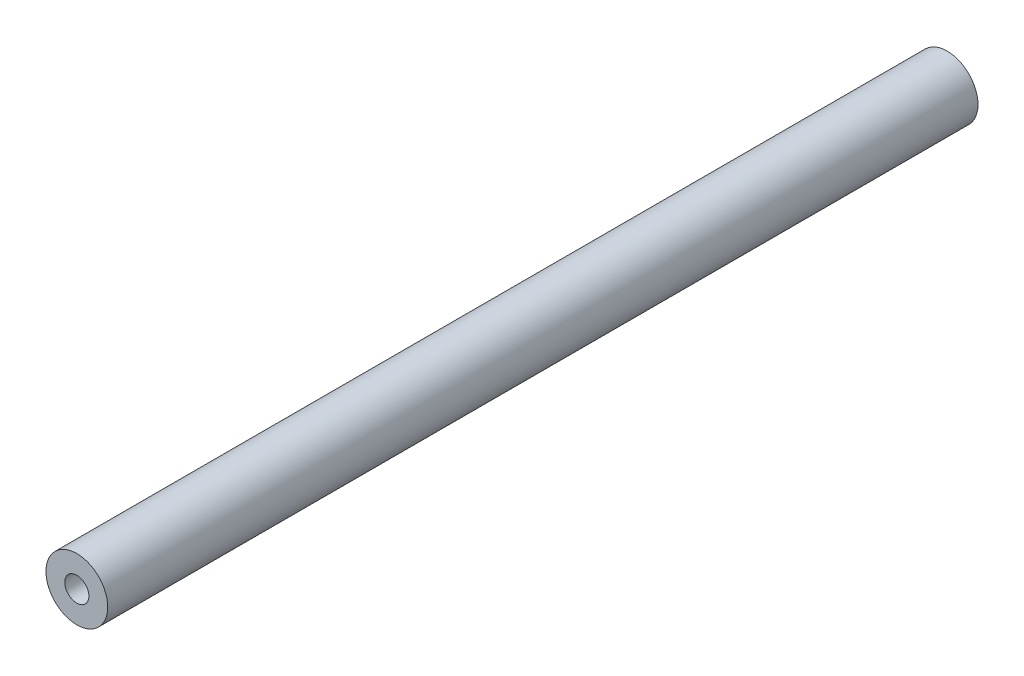
ISO-10303-21;
HEADER;
FILE_DESCRIPTION(('STEP AP214'),'2;1');
FILE_NAME('part.step','',(''),(''),'','','');
FILE_SCHEMA(('AUTOMOTIVE_DESIGN { 1 0 10303 214 1 1 1 1 }'));
ENDSEC;
DATA;
#1=APPLICATION_CONTEXT('core data for automotive mechanical design processes');
#2=APPLICATION_PROTOCOL_DEFINITION('international standard','automotive_design',2000,#1);
#3=PRODUCT_CONTEXT('',#1,'mechanical');
#4=PRODUCT('Part','Part','',(#3));
#5=PRODUCT_RELATED_PRODUCT_CATEGORY('part','',(#4));
#6=PRODUCT_DEFINITION_FORMATION('','',#4);
#7=PRODUCT_DEFINITION_CONTEXT('part definition',#1,'design');
#8=PRODUCT_DEFINITION('design','',#6,#7);
#9=PRODUCT_DEFINITION_SHAPE('','',#8);
#10=(LENGTH_UNIT() NAMED_UNIT(*) SI_UNIT(.MILLI.,.METRE.));
#11=(NAMED_UNIT(*) PLANE_ANGLE_UNIT() SI_UNIT($,.RADIAN.));
#12=(NAMED_UNIT(*) SI_UNIT($,.STERADIAN.) SOLID_ANGLE_UNIT());
#13=UNCERTAINTY_MEASURE_WITH_UNIT(LENGTH_MEASURE(1.E-05),#10,'distance_accuracy_value','');
#14=(GEOMETRIC_REPRESENTATION_CONTEXT(3) GLOBAL_UNCERTAINTY_ASSIGNED_CONTEXT((#13)) GLOBAL_UNIT_ASSIGNED_CONTEXT((#10,
#11,#12)) REPRESENTATION_CONTEXT('',''));
#15=CARTESIAN_POINT('',(0.,0.,0.));
#16=DIRECTION('',(0.,0.,1.));
#17=DIRECTION('',(1.,0.,0.));
#18=AXIS2_PLACEMENT_3D('',#15,#16,#17);
#19=CARTESIAN_POINT('',(0.,0.,155.));
#20=DIRECTION('',(0.,0.,-1.));
#21=DIRECTION('',(-1.,0.,0.));
#22=AXIS2_PLACEMENT_3D('',#19,#20,#21);
#23=CYLINDRICAL_SURFACE('',#22,5.5);
#24=CARTESIAN_POINT('',(0.,0.,155.));
#25=DIRECTION('',(0.,0.,1.));
#26=DIRECTION('',(1.,0.,0.));
#27=AXIS2_PLACEMENT_3D('',#24,#25,#26);
#28=CIRCLE('',#27,5.5);
#29=CARTESIAN_POINT('',(5.5,0.,155.));
#30=VERTEX_POINT('',#29);
#31=EDGE_CURVE('E10',#30,#30,#28,.T.);
#32=ORIENTED_EDGE('',*,*,#31,.F.);
#33=EDGE_LOOP('',(#32));
#34=FACE_BOUND('',#33,.T.);
#35=CARTESIAN_POINT('',(0.,0.,0.));
#36=DIRECTION('',(0.,0.,1.));
#37=DIRECTION('',(1.,0.,0.));
#38=AXIS2_PLACEMENT_3D('',#35,#36,#37);
#39=CIRCLE('',#38,5.5);
#40=CARTESIAN_POINT('',(5.5,0.,0.));
#41=VERTEX_POINT('',#40);
#42=EDGE_CURVE('E34',#41,#41,#39,.T.);
#43=ORIENTED_EDGE('',*,*,#42,.T.);
#44=EDGE_LOOP('',(#43));
#45=FACE_BOUND('',#44,.T.);
#46=ADVANCED_FACE('F31',(#34,#45),#23,.T.);
#47=CARTESIAN_POINT('',(0.,0.,155.));
#48=DIRECTION('',(0.,0.,1.));
#49=DIRECTION('',(1.,0.,0.));
#50=AXIS2_PLACEMENT_3D('',#47,#48,#49);
#51=PLANE('',#50);
#52=CARTESIAN_POINT('',(0.,0.,155.));
#53=DIRECTION('',(0.,0.,1.));
#54=DIRECTION('',(1.,0.,0.));
#55=AXIS2_PLACEMENT_3D('',#52,#53,#54);
#56=CIRCLE('',#55,2.15);
#57=CARTESIAN_POINT('',(2.15,0.,155.));
#58=VERTEX_POINT('',#57);
#59=EDGE_CURVE('E43',#58,#58,#56,.T.);
#60=ORIENTED_EDGE('',*,*,#59,.F.);
#61=EDGE_LOOP('',(#60));
#62=FACE_BOUND('',#61,.T.);
#63=ORIENTED_EDGE('',*,*,#31,.T.);
#64=EDGE_LOOP('',(#63));
#65=FACE_BOUND('',#64,.T.);
#66=ADVANCED_FACE('F58',(#62,#65),#51,.T.);
#67=CARTESIAN_POINT('',(0.,0.,0.));
#68=DIRECTION('',(0.,0.,1.));
#69=DIRECTION('',(1.,0.,0.));
#70=AXIS2_PLACEMENT_3D('',#67,#68,#69);
#71=PLANE('',#70);
#72=ORIENTED_EDGE('',*,*,#42,.F.);
#73=EDGE_LOOP('',(#72));
#74=FACE_BOUND('',#73,.T.);
#75=ADVANCED_FACE('F54',(#74),#71,.F.);
#76=CARTESIAN_POINT('',(0.,0.,5.));
#77=DIRECTION('',(0.,0.,1.));
#78=DIRECTION('',(1.,0.,0.));
#79=AXIS2_PLACEMENT_3D('',#76,#77,#78);
#80=CYLINDRICAL_SURFACE('',#79,2.15);
#81=CARTESIAN_POINT('',(0.,0.,5.));
#82=DIRECTION('',(0.,0.,1.));
#83=DIRECTION('',(1.,0.,0.));
#84=AXIS2_PLACEMENT_3D('',#81,#82,#83);
#85=CIRCLE('',#84,2.15);
#86=CARTESIAN_POINT('',(2.15,0.,5.));
#87=VERTEX_POINT('',#86);
#88=EDGE_CURVE('E41',#87,#87,#85,.T.);
#89=ORIENTED_EDGE('',*,*,#88,.F.);
#90=EDGE_LOOP('',(#89));
#91=FACE_BOUND('',#90,.T.);
#92=ORIENTED_EDGE('',*,*,#59,.T.);
#93=EDGE_LOOP('',(#92));
#94=FACE_BOUND('',#93,.T.);
#95=ADVANCED_FACE('F51',(#91,#94),#80,.F.);
#96=CARTESIAN_POINT('',(0.,0.,5.));
#97=DIRECTION('',(0.,0.,1.));
#98=DIRECTION('',(1.,0.,0.));
#99=AXIS2_PLACEMENT_3D('',#96,#97,#98);
#100=PLANE('',#99);
#101=ORIENTED_EDGE('',*,*,#88,.T.);
#102=EDGE_LOOP('',(#101));
#103=FACE_BOUND('',#102,.T.);
#104=ADVANCED_FACE('F49',(#103),#100,.T.);
#105=CLOSED_SHELL('',(#46,#66,#75,#95,#104));
#106=MANIFOLD_SOLID_BREP('B2',#105);
#107=ADVANCED_BREP_SHAPE_REPRESENTATION('',(#18,#106),#14);
#108=SHAPE_DEFINITION_REPRESENTATION(#9,#107);
ENDSEC;
END-ISO-10303-21;
